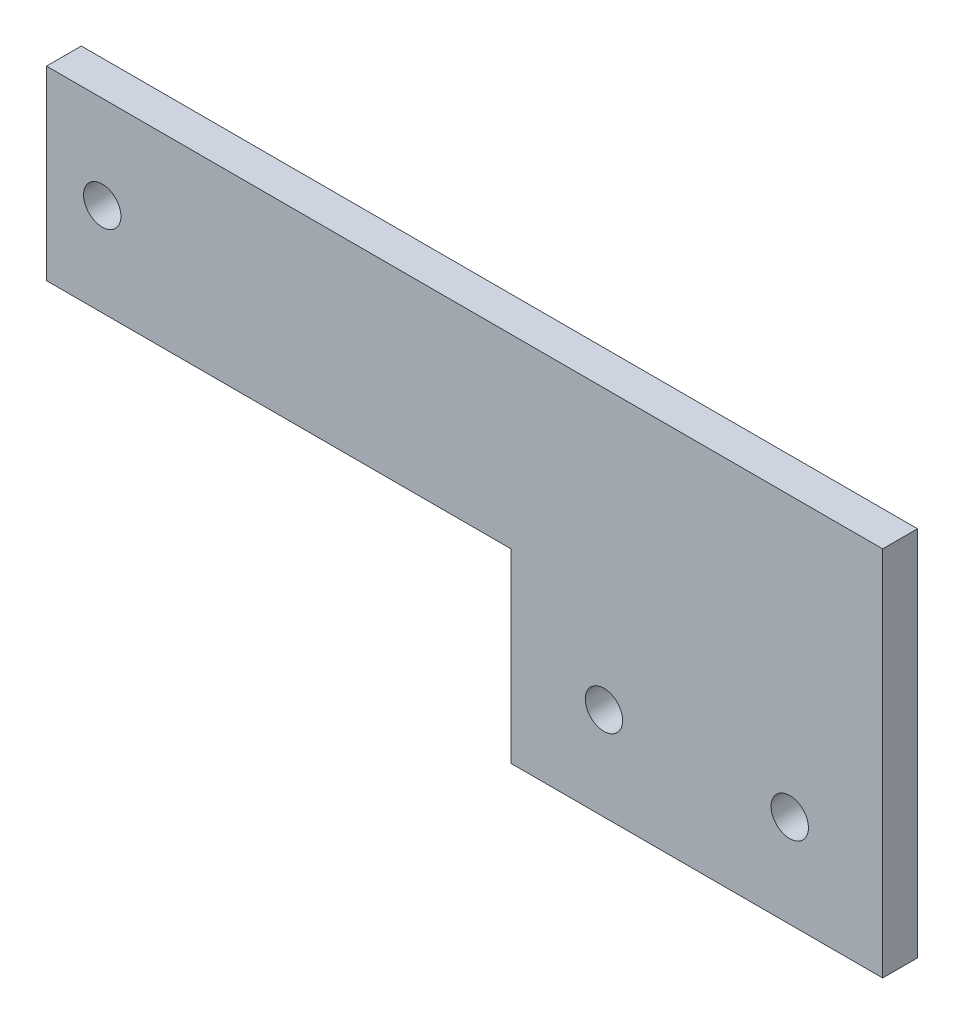
ISO-10303-21;
HEADER;
FILE_DESCRIPTION(('STEP AP214'),'2;1');
FILE_NAME('part.step','',(''),(''),'','','');
FILE_SCHEMA(('AUTOMOTIVE_DESIGN { 1 0 10303 214 1 1 1 1 }'));
ENDSEC;
DATA;
#1=APPLICATION_CONTEXT('core data for automotive mechanical design processes');
#2=APPLICATION_PROTOCOL_DEFINITION('international standard','automotive_design',2000,#1);
#3=PRODUCT_CONTEXT('',#1,'mechanical');
#4=PRODUCT('Part','Part','',(#3));
#5=PRODUCT_RELATED_PRODUCT_CATEGORY('part','',(#4));
#6=PRODUCT_DEFINITION_FORMATION('','',#4);
#7=PRODUCT_DEFINITION_CONTEXT('part definition',#1,'design');
#8=PRODUCT_DEFINITION('design','',#6,#7);
#9=PRODUCT_DEFINITION_SHAPE('','',#8);
#10=(LENGTH_UNIT() NAMED_UNIT(*) SI_UNIT(.MILLI.,.METRE.));
#11=(NAMED_UNIT(*) PLANE_ANGLE_UNIT() SI_UNIT($,.RADIAN.));
#12=(NAMED_UNIT(*) SI_UNIT($,.STERADIAN.) SOLID_ANGLE_UNIT());
#13=UNCERTAINTY_MEASURE_WITH_UNIT(LENGTH_MEASURE(1.E-05),#10,'distance_accuracy_value','');
#14=(GEOMETRIC_REPRESENTATION_CONTEXT(3) GLOBAL_UNCERTAINTY_ASSIGNED_CONTEXT((#13)) GLOBAL_UNIT_ASSIGNED_CONTEXT((#10,
#11,#12)) REPRESENTATION_CONTEXT('',''));
#15=CARTESIAN_POINT('',(0.,0.,0.));
#16=DIRECTION('',(0.,0.,1.));
#17=DIRECTION('',(1.,0.,0.));
#18=AXIS2_PLACEMENT_3D('',#15,#16,#17);
#19=CARTESIAN_POINT('',(0.,0.,4.7625));
#20=DIRECTION('',(0.,1.,0.));
#21=DIRECTION('',(0.,0.,1.));
#22=AXIS2_PLACEMENT_3D('',#19,#20,#21);
#23=PLANE('',#22);
#24=DIRECTION('',(1.,0.,0.));
#25=VECTOR('',#24,1.);
#26=CARTESIAN_POINT('',(0.,0.,0.));
#27=LINE('',#26,#25);
#28=CARTESIAN_POINT('',(0.,0.,0.));
#29=VERTEX_POINT('',#28);
#30=CARTESIAN_POINT('',(50.8,0.,0.));
#31=VERTEX_POINT('',#30);
#32=EDGE_CURVE('E130',#29,#31,#27,.T.);
#33=ORIENTED_EDGE('',*,*,#32,.T.);
#34=DIRECTION('',(0.,0.,-1.));
#35=VECTOR('',#34,1.);
#36=CARTESIAN_POINT('',(50.8,0.,4.7625));
#37=LINE('',#36,#35);
#38=CARTESIAN_POINT('',(50.8,0.,4.7625));
#39=VERTEX_POINT('',#38);
#40=EDGE_CURVE('E11',#39,#31,#37,.T.);
#41=ORIENTED_EDGE('',*,*,#40,.F.);
#42=DIRECTION('',(1.,0.,0.));
#43=VECTOR('',#42,1.);
#44=CARTESIAN_POINT('',(0.,0.,4.7625));
#45=LINE('',#44,#43);
#46=CARTESIAN_POINT('',(0.,0.,4.7625));
#47=VERTEX_POINT('',#46);
#48=EDGE_CURVE('E253',#47,#39,#45,.T.);
#49=ORIENTED_EDGE('',*,*,#48,.F.);
#50=DIRECTION('',(0.,0.,-1.));
#51=VECTOR('',#50,1.);
#52=CARTESIAN_POINT('',(0.,0.,4.7625));
#53=LINE('',#52,#51);
#54=EDGE_CURVE('E52',#47,#29,#53,.T.);
#55=ORIENTED_EDGE('',*,*,#54,.T.);
#56=EDGE_LOOP('',(#33,#41,#49,#55));
#57=FACE_BOUND('',#56,.T.);
#58=ADVANCED_FACE('F35',(#57),#23,.F.);
#59=CARTESIAN_POINT('',(50.8,0.,4.7625));
#60=DIRECTION('',(-1.,0.,0.));
#61=DIRECTION('',(0.,0.,1.));
#62=AXIS2_PLACEMENT_3D('',#59,#60,#61);
#63=PLANE('',#62);
#64=DIRECTION('',(0.,1.,0.));
#65=VECTOR('',#64,1.);
#66=CARTESIAN_POINT('',(50.8,0.,0.));
#67=LINE('',#66,#65);
#68=CARTESIAN_POINT('',(50.8,50.8,0.));
#69=VERTEX_POINT('',#68);
#70=EDGE_CURVE('E132',#31,#69,#67,.T.);
#71=ORIENTED_EDGE('',*,*,#70,.T.);
#72=DIRECTION('',(0.,0.,-1.));
#73=VECTOR('',#72,1.);
#74=CARTESIAN_POINT('',(50.8,50.8,4.7625));
#75=LINE('',#74,#73);
#76=CARTESIAN_POINT('',(50.8,50.8,4.7625));
#77=VERTEX_POINT('',#76);
#78=EDGE_CURVE('E44',#77,#69,#75,.T.);
#79=ORIENTED_EDGE('',*,*,#78,.F.);
#80=DIRECTION('',(0.,1.,0.));
#81=VECTOR('',#80,1.);
#82=CARTESIAN_POINT('',(50.8,0.,4.7625));
#83=LINE('',#82,#81);
#84=EDGE_CURVE('E85',#39,#77,#83,.T.);
#85=ORIENTED_EDGE('',*,*,#84,.F.);
#86=ORIENTED_EDGE('',*,*,#40,.T.);
#87=EDGE_LOOP('',(#71,#79,#85,#86));
#88=FACE_BOUND('',#87,.T.);
#89=ADVANCED_FACE('F153',(#88),#63,.F.);
#90=CARTESIAN_POINT('',(0.,50.8,4.7625));
#91=DIRECTION('',(0.,1.,0.));
#92=DIRECTION('',(0.,0.,1.));
#93=AXIS2_PLACEMENT_3D('',#90,#91,#92);
#94=PLANE('',#93);
#95=DIRECTION('',(1.,0.,0.));
#96=VECTOR('',#95,1.);
#97=CARTESIAN_POINT('',(0.,50.8,0.));
#98=LINE('',#97,#96);
#99=CARTESIAN_POINT('',(-63.5,50.8,0.));
#100=VERTEX_POINT('',#99);
#101=EDGE_CURVE('E135',#100,#69,#98,.T.);
#102=ORIENTED_EDGE('',*,*,#101,.F.);
#103=DIRECTION('',(0.,0.,-1.));
#104=VECTOR('',#103,1.);
#105=CARTESIAN_POINT('',(-63.5,50.8,4.7625));
#106=LINE('',#105,#104);
#107=CARTESIAN_POINT('',(-63.5,50.8,4.7625));
#108=VERTEX_POINT('',#107);
#109=EDGE_CURVE('E113',#108,#100,#106,.T.);
#110=ORIENTED_EDGE('',*,*,#109,.F.);
#111=DIRECTION('',(1.,0.,0.));
#112=VECTOR('',#111,1.);
#113=CARTESIAN_POINT('',(0.,50.8,4.7625));
#114=LINE('',#113,#112);
#115=EDGE_CURVE('E103',#108,#77,#114,.T.);
#116=ORIENTED_EDGE('',*,*,#115,.T.);
#117=ORIENTED_EDGE('',*,*,#78,.T.);
#118=EDGE_LOOP('',(#102,#110,#116,#117));
#119=FACE_BOUND('',#118,.T.);
#120=ADVANCED_FACE('F152',(#119),#94,.T.);
#121=CARTESIAN_POINT('',(-63.5,0.,4.7625));
#122=DIRECTION('',(1.,0.,0.));
#123=DIRECTION('',(0.,1.,0.));
#124=AXIS2_PLACEMENT_3D('',#121,#122,#123);
#125=PLANE('',#124);
#126=DIRECTION('',(0.,-1.,0.));
#127=VECTOR('',#126,1.);
#128=CARTESIAN_POINT('',(-63.5,0.,0.));
#129=LINE('',#128,#127);
#130=CARTESIAN_POINT('',(-63.5,25.4,0.));
#131=VERTEX_POINT('',#130);
#132=EDGE_CURVE('E110',#100,#131,#129,.T.);
#133=ORIENTED_EDGE('',*,*,#132,.T.);
#134=DIRECTION('',(0.,0.,-1.));
#135=VECTOR('',#134,1.);
#136=CARTESIAN_POINT('',(-63.5,25.4,4.7625));
#137=LINE('',#136,#135);
#138=CARTESIAN_POINT('',(-63.5,25.4,4.7625));
#139=VERTEX_POINT('',#138);
#140=EDGE_CURVE('E107',#139,#131,#137,.T.);
#141=ORIENTED_EDGE('',*,*,#140,.F.);
#142=DIRECTION('',(0.,-1.,0.));
#143=VECTOR('',#142,1.);
#144=CARTESIAN_POINT('',(-63.5,0.,4.7625));
#145=LINE('',#144,#143);
#146=EDGE_CURVE('E95',#108,#139,#145,.T.);
#147=ORIENTED_EDGE('',*,*,#146,.F.);
#148=ORIENTED_EDGE('',*,*,#109,.T.);
#149=EDGE_LOOP('',(#133,#141,#147,#148));
#150=FACE_BOUND('',#149,.T.);
#151=ADVANCED_FACE('F108',(#150),#125,.F.);
#152=CARTESIAN_POINT('',(0.,25.4,4.7625));
#153=DIRECTION('',(0.,1.,0.));
#154=DIRECTION('',(-1.,0.,0.));
#155=AXIS2_PLACEMENT_3D('',#152,#153,#154);
#156=PLANE('',#155);
#157=DIRECTION('',(1.,0.,0.));
#158=VECTOR('',#157,1.);
#159=CARTESIAN_POINT('',(0.,25.4,0.));
#160=LINE('',#159,#158);
#161=CARTESIAN_POINT('',(0.,25.4,0.));
#162=VERTEX_POINT('',#161);
#163=EDGE_CURVE('E139',#131,#162,#160,.T.);
#164=ORIENTED_EDGE('',*,*,#163,.T.);
#165=DIRECTION('',(0.,0.,-1.));
#166=VECTOR('',#165,1.);
#167=CARTESIAN_POINT('',(0.,25.4,4.7625));
#168=LINE('',#167,#166);
#169=CARTESIAN_POINT('',(0.,25.4,4.7625));
#170=VERTEX_POINT('',#169);
#171=EDGE_CURVE('E73',#170,#162,#168,.T.);
#172=ORIENTED_EDGE('',*,*,#171,.F.);
#173=DIRECTION('',(1.,0.,0.));
#174=VECTOR('',#173,1.);
#175=CARTESIAN_POINT('',(0.,25.4,4.7625));
#176=LINE('',#175,#174);
#177=EDGE_CURVE('E101',#139,#170,#176,.T.);
#178=ORIENTED_EDGE('',*,*,#177,.F.);
#179=ORIENTED_EDGE('',*,*,#140,.T.);
#180=EDGE_LOOP('',(#164,#172,#178,#179));
#181=FACE_BOUND('',#180,.T.);
#182=ADVANCED_FACE('F115',(#181),#156,.F.);
#183=CARTESIAN_POINT('',(0.,0.,4.7625));
#184=DIRECTION('',(-1.,0.,0.));
#185=DIRECTION('',(0.,0.,1.));
#186=AXIS2_PLACEMENT_3D('',#183,#184,#185);
#187=PLANE('',#186);
#188=DIRECTION('',(0.,1.,0.));
#189=VECTOR('',#188,1.);
#190=CARTESIAN_POINT('',(0.,0.,0.));
#191=LINE('',#190,#189);
#192=EDGE_CURVE('E141',#29,#162,#191,.T.);
#193=ORIENTED_EDGE('',*,*,#192,.F.);
#194=ORIENTED_EDGE('',*,*,#54,.F.);
#195=DIRECTION('',(0.,1.,0.));
#196=VECTOR('',#195,1.);
#197=CARTESIAN_POINT('',(0.,0.,4.7625));
#198=LINE('',#197,#196);
#199=EDGE_CURVE('E116',#47,#170,#198,.T.);
#200=ORIENTED_EDGE('',*,*,#199,.T.);
#201=ORIENTED_EDGE('',*,*,#171,.T.);
#202=EDGE_LOOP('',(#193,#194,#200,#201));
#203=FACE_BOUND('',#202,.T.);
#204=ADVANCED_FACE('F158',(#203),#187,.T.);
#205=CARTESIAN_POINT('',(12.7,12.7,4.7625));
#206=DIRECTION('',(0.,0.,-1.));
#207=DIRECTION('',(-1.,0.,0.));
#208=AXIS2_PLACEMENT_3D('',#205,#206,#207);
#209=CYLINDRICAL_SURFACE('',#208,2.5527);
#210=CARTESIAN_POINT('',(12.7,12.7,4.7625));
#211=DIRECTION('',(0.,0.,1.));
#212=DIRECTION('',(1.,0.,0.));
#213=AXIS2_PLACEMENT_3D('',#210,#211,#212);
#214=CIRCLE('',#213,2.5527);
#215=CARTESIAN_POINT('',(10.1473,12.7,4.7625));
#216=VERTEX_POINT('',#215);
#217=EDGE_CURVE('E252',#216,#216,#214,.T.);
#218=CARTESIAN_POINT('',(12.7,12.7,0.));
#219=DIRECTION('',(0.,0.,1.));
#220=DIRECTION('',(1.,0.,0.));
#221=AXIS2_PLACEMENT_3D('',#218,#219,#220);
#222=CIRCLE('',#221,2.5527);
#223=CARTESIAN_POINT('',(10.1473,12.7,0.));
#224=VERTEX_POINT('',#223);
#225=EDGE_CURVE('E127',#224,#224,#222,.T.);
#226=CARTESIAN_POINT('',(10.1473,12.7,4.7625));
#227=CARTESIAN_POINT('',(10.1473,12.7,4.712890625));
#228=CARTESIAN_POINT('',(10.1473,12.7,4.66328125));
#229=CARTESIAN_POINT('',(10.1473,12.7,4.5640625));
#230=CARTESIAN_POINT('',(10.1473,12.7,4.514453125));
#231=CARTESIAN_POINT('',(10.1473,12.7,4.415234375));
#232=CARTESIAN_POINT('',(10.1473,12.7,4.365625));
#233=CARTESIAN_POINT('',(10.1473,12.7,4.26640625));
#234=CARTESIAN_POINT('',(10.1473,12.7,4.216796875));
#235=CARTESIAN_POINT('',(10.1473,12.7,4.117578125));
#236=CARTESIAN_POINT('',(10.1473,12.7,4.06796875));
#237=CARTESIAN_POINT('',(10.1473,12.7,3.96875));
#238=CARTESIAN_POINT('',(10.1473,12.7,3.919140625));
#239=CARTESIAN_POINT('',(10.1473,12.7,3.819921875));
#240=CARTESIAN_POINT('',(10.1473,12.7,3.7703125));
#241=CARTESIAN_POINT('',(10.1473,12.7,3.67109375));
#242=CARTESIAN_POINT('',(10.1473,12.7,3.621484375));
#243=CARTESIAN_POINT('',(10.1473,12.7,3.522265625));
#244=CARTESIAN_POINT('',(10.1473,12.7,3.47265625));
#245=CARTESIAN_POINT('',(10.1473,12.7,3.3734375));
#246=CARTESIAN_POINT('',(10.1473,12.7,3.323828125));
#247=CARTESIAN_POINT('',(10.1473,12.7,3.224609375));
#248=CARTESIAN_POINT('',(10.1473,12.7,3.175));
#249=CARTESIAN_POINT('',(10.1473,12.7,3.07578125));
#250=CARTESIAN_POINT('',(10.1473,12.7,3.026171875));
#251=CARTESIAN_POINT('',(10.1473,12.7,2.926953125));
#252=CARTESIAN_POINT('',(10.1473,12.7,2.87734375));
#253=CARTESIAN_POINT('',(10.1473,12.7,2.778125));
#254=CARTESIAN_POINT('',(10.1473,12.7,2.728515625));
#255=CARTESIAN_POINT('',(10.1473,12.7,2.629296875));
#256=CARTESIAN_POINT('',(10.1473,12.7,2.5796875));
#257=CARTESIAN_POINT('',(10.1473,12.7,2.48046875));
#258=CARTESIAN_POINT('',(10.1473,12.7,2.430859375));
#259=CARTESIAN_POINT('',(10.1473,12.7,2.331640625));
#260=CARTESIAN_POINT('',(10.1473,12.7,2.28203125));
#261=CARTESIAN_POINT('',(10.1473,12.7,2.1828125));
#262=CARTESIAN_POINT('',(10.1473,12.7,2.133203125));
#263=CARTESIAN_POINT('',(10.1473,12.7,2.033984375));
#264=CARTESIAN_POINT('',(10.1473,12.7,1.984375));
#265=CARTESIAN_POINT('',(10.1473,12.7,1.88515625));
#266=CARTESIAN_POINT('',(10.1473,12.7,1.835546875));
#267=CARTESIAN_POINT('',(10.1473,12.7,1.736328125));
#268=CARTESIAN_POINT('',(10.1473,12.7,1.68671875));
#269=CARTESIAN_POINT('',(10.1473,12.7,1.5875));
#270=CARTESIAN_POINT('',(10.1473,12.7,1.537890625));
#271=CARTESIAN_POINT('',(10.1473,12.7,1.438671875));
#272=CARTESIAN_POINT('',(10.1473,12.7,1.3890625));
#273=CARTESIAN_POINT('',(10.1473,12.7,1.28984375));
#274=CARTESIAN_POINT('',(10.1473,12.7,1.240234375));
#275=CARTESIAN_POINT('',(10.1473,12.7,1.141015625));
#276=CARTESIAN_POINT('',(10.1473,12.7,1.09140625));
#277=CARTESIAN_POINT('',(10.1473,12.7,0.992187499999999));
#278=CARTESIAN_POINT('',(10.1473,12.7,0.942578124999999));
#279=CARTESIAN_POINT('',(10.1473,12.7,0.843359375));
#280=CARTESIAN_POINT('',(10.1473,12.7,0.79375));
#281=CARTESIAN_POINT('',(10.1473,12.7,0.69453125));
#282=CARTESIAN_POINT('',(10.1473,12.7,0.644921875));
#283=CARTESIAN_POINT('',(10.1473,12.7,0.545703125));
#284=CARTESIAN_POINT('',(10.1473,12.7,0.49609375));
#285=CARTESIAN_POINT('',(10.1473,12.7,0.396875));
#286=CARTESIAN_POINT('',(10.1473,12.7,0.347265625));
#287=CARTESIAN_POINT('',(10.1473,12.7,0.248046875));
#288=CARTESIAN_POINT('',(10.1473,12.7,0.1984375));
#289=CARTESIAN_POINT('',(10.1473,12.7,0.09921875));
#290=CARTESIAN_POINT('',(10.1473,12.7,0.049609375));
#291=CARTESIAN_POINT('',(10.1473,12.7,0.));
#292=B_SPLINE_CURVE_WITH_KNOTS('',3,(#226,#227,#228,#229,#230,#231,#232,#233,#234,#235,#236,
#237,#238,#239,#240,#241,#242,#243,#244,#245,#246,#247,#248,#249,#250,#251,#252,#253,#254,#255,
#256,#257,#258,#259,#260,#261,#262,#263,#264,#265,#266,#267,#268,#269,#270,#271,#272,#273,#274,
#275,#276,#277,#278,#279,#280,#281,#282,#283,#284,#285,#286,#287,#288,#289,#290,#291),
.UNSPECIFIED.,.F.,.F.,(4,2,2,2,2,2,2,2,2,2,2,2,2,2,2,2,2,2,2,2,2,2,2,2,2,2,2,2,2,2,2,2,4),(0.,
0.148828125,0.29765625,0.446484375,0.5953125,0.744140625,0.892968750000001,1.041796875,1.190625,
1.339453125,1.48828125,1.637109375,1.7859375,1.934765625,2.08359375,2.232421875,2.38125,
2.530078125,2.67890625,2.827734375,2.9765625,3.125390625,3.27421875,3.423046875,3.571875,
3.720703125,3.86953125,4.018359375,4.1671875,4.316015625,4.46484375,4.613671875,4.7625),.UNSPECIFIED.);
#293=EDGE_CURVE('BSEAM160',#216,#224,#292,.T.);
#294=ORIENTED_EDGE('',*,*,#217,.T.);
#295=ORIENTED_EDGE('',*,*,#225,.F.);
#296=ORIENTED_EDGE('',*,*,#293,.T.);
#297=ORIENTED_EDGE('',*,*,#293,.F.);
#298=EDGE_LOOP('',(#294,#296,#295,#297));
#299=FACE_BOUND('',#298,.T.);
#300=ADVANCED_FACE('F160',(#299),#209,.F.);
#301=CARTESIAN_POINT('',(38.1,12.7,4.7625));
#302=DIRECTION('',(0.,0.,-1.));
#303=DIRECTION('',(-1.,0.,0.));
#304=AXIS2_PLACEMENT_3D('',#301,#302,#303);
#305=CYLINDRICAL_SURFACE('',#304,2.5527);
#306=CARTESIAN_POINT('',(38.1,12.7,4.7625));
#307=DIRECTION('',(0.,0.,1.));
#308=DIRECTION('',(1.,0.,0.));
#309=AXIS2_PLACEMENT_3D('',#306,#307,#308);
#310=CIRCLE('',#309,2.5527);
#311=CARTESIAN_POINT('',(35.5473,12.7,4.7625));
#312=VERTEX_POINT('',#311);
#313=EDGE_CURVE('E147',#312,#312,#310,.T.);
#314=CARTESIAN_POINT('',(38.1,12.7,0.));
#315=DIRECTION('',(0.,0.,1.));
#316=DIRECTION('',(1.,0.,0.));
#317=AXIS2_PLACEMENT_3D('',#314,#315,#316);
#318=CIRCLE('',#317,2.5527);
#319=CARTESIAN_POINT('',(35.5473,12.7,0.));
#320=VERTEX_POINT('',#319);
#321=EDGE_CURVE('E124',#320,#320,#318,.T.);
#322=CARTESIAN_POINT('',(35.5473,12.7,4.7625));
#323=CARTESIAN_POINT('',(35.5473,12.7,4.712890625));
#324=CARTESIAN_POINT('',(35.5473,12.7,4.66328125));
#325=CARTESIAN_POINT('',(35.5473,12.7,4.5640625));
#326=CARTESIAN_POINT('',(35.5473,12.7,4.514453125));
#327=CARTESIAN_POINT('',(35.5473,12.7,4.415234375));
#328=CARTESIAN_POINT('',(35.5473,12.7,4.365625));
#329=CARTESIAN_POINT('',(35.5473,12.7,4.26640625));
#330=CARTESIAN_POINT('',(35.5473,12.7,4.216796875));
#331=CARTESIAN_POINT('',(35.5473,12.7,4.117578125));
#332=CARTESIAN_POINT('',(35.5473,12.7,4.06796875));
#333=CARTESIAN_POINT('',(35.5473,12.7,3.96875));
#334=CARTESIAN_POINT('',(35.5473,12.7,3.919140625));
#335=CARTESIAN_POINT('',(35.5473,12.7,3.819921875));
#336=CARTESIAN_POINT('',(35.5473,12.7,3.7703125));
#337=CARTESIAN_POINT('',(35.5473,12.7,3.67109375));
#338=CARTESIAN_POINT('',(35.5473,12.7,3.621484375));
#339=CARTESIAN_POINT('',(35.5473,12.7,3.522265625));
#340=CARTESIAN_POINT('',(35.5473,12.7,3.47265625));
#341=CARTESIAN_POINT('',(35.5473,12.7,3.3734375));
#342=CARTESIAN_POINT('',(35.5473,12.7,3.323828125));
#343=CARTESIAN_POINT('',(35.5473,12.7,3.224609375));
#344=CARTESIAN_POINT('',(35.5473,12.7,3.175));
#345=CARTESIAN_POINT('',(35.5473,12.7,3.07578125));
#346=CARTESIAN_POINT('',(35.5473,12.7,3.026171875));
#347=CARTESIAN_POINT('',(35.5473,12.7,2.926953125));
#348=CARTESIAN_POINT('',(35.5473,12.7,2.87734375));
#349=CARTESIAN_POINT('',(35.5473,12.7,2.778125));
#350=CARTESIAN_POINT('',(35.5473,12.7,2.728515625));
#351=CARTESIAN_POINT('',(35.5473,12.7,2.629296875));
#352=CARTESIAN_POINT('',(35.5473,12.7,2.5796875));
#353=CARTESIAN_POINT('',(35.5473,12.7,2.48046875));
#354=CARTESIAN_POINT('',(35.5473,12.7,2.430859375));
#355=CARTESIAN_POINT('',(35.5473,12.7,2.331640625));
#356=CARTESIAN_POINT('',(35.5473,12.7,2.28203125));
#357=CARTESIAN_POINT('',(35.5473,12.7,2.1828125));
#358=CARTESIAN_POINT('',(35.5473,12.7,2.133203125));
#359=CARTESIAN_POINT('',(35.5473,12.7,2.033984375));
#360=CARTESIAN_POINT('',(35.5473,12.7,1.984375));
#361=CARTESIAN_POINT('',(35.5473,12.7,1.88515625));
#362=CARTESIAN_POINT('',(35.5473,12.7,1.835546875));
#363=CARTESIAN_POINT('',(35.5473,12.7,1.736328125));
#364=CARTESIAN_POINT('',(35.5473,12.7,1.68671875));
#365=CARTESIAN_POINT('',(35.5473,12.7,1.5875));
#366=CARTESIAN_POINT('',(35.5473,12.7,1.537890625));
#367=CARTESIAN_POINT('',(35.5473,12.7,1.438671875));
#368=CARTESIAN_POINT('',(35.5473,12.7,1.3890625));
#369=CARTESIAN_POINT('',(35.5473,12.7,1.28984375));
#370=CARTESIAN_POINT('',(35.5473,12.7,1.240234375));
#371=CARTESIAN_POINT('',(35.5473,12.7,1.141015625));
#372=CARTESIAN_POINT('',(35.5473,12.7,1.09140625));
#373=CARTESIAN_POINT('',(35.5473,12.7,0.992187499999999));
#374=CARTESIAN_POINT('',(35.5473,12.7,0.942578124999999));
#375=CARTESIAN_POINT('',(35.5473,12.7,0.843359375));
#376=CARTESIAN_POINT('',(35.5473,12.7,0.79375));
#377=CARTESIAN_POINT('',(35.5473,12.7,0.69453125));
#378=CARTESIAN_POINT('',(35.5473,12.7,0.644921875));
#379=CARTESIAN_POINT('',(35.5473,12.7,0.545703125));
#380=CARTESIAN_POINT('',(35.5473,12.7,0.49609375));
#381=CARTESIAN_POINT('',(35.5473,12.7,0.396875));
#382=CARTESIAN_POINT('',(35.5473,12.7,0.347265625));
#383=CARTESIAN_POINT('',(35.5473,12.7,0.248046875));
#384=CARTESIAN_POINT('',(35.5473,12.7,0.1984375));
#385=CARTESIAN_POINT('',(35.5473,12.7,0.09921875));
#386=CARTESIAN_POINT('',(35.5473,12.7,0.049609375));
#387=CARTESIAN_POINT('',(35.5473,12.7,0.));
#388=B_SPLINE_CURVE_WITH_KNOTS('',3,(#322,#323,#324,#325,#326,#327,#328,#329,#330,#331,#332,
#333,#334,#335,#336,#337,#338,#339,#340,#341,#342,#343,#344,#345,#346,#347,#348,#349,#350,#351,
#352,#353,#354,#355,#356,#357,#358,#359,#360,#361,#362,#363,#364,#365,#366,#367,#368,#369,#370,
#371,#372,#373,#374,#375,#376,#377,#378,#379,#380,#381,#382,#383,#384,#385,#386,#387),
.UNSPECIFIED.,.F.,.F.,(4,2,2,2,2,2,2,2,2,2,2,2,2,2,2,2,2,2,2,2,2,2,2,2,2,2,2,2,2,2,2,2,4),(0.,
0.148828125,0.29765625,0.446484375,0.5953125,0.744140625,0.892968750000001,1.041796875,1.190625,
1.339453125,1.48828125,1.637109375,1.7859375,1.934765625,2.08359375,2.232421875,2.38125,
2.530078125,2.67890625,2.827734375,2.9765625,3.125390625,3.27421875,3.423046875,3.571875,
3.720703125,3.86953125,4.018359375,4.1671875,4.316015625,4.46484375,4.613671875,4.7625),.UNSPECIFIED.);
#389=EDGE_CURVE('BSEAM37',#312,#320,#388,.T.);
#390=ORIENTED_EDGE('',*,*,#313,.T.);
#391=ORIENTED_EDGE('',*,*,#321,.F.);
#392=ORIENTED_EDGE('',*,*,#389,.T.);
#393=ORIENTED_EDGE('',*,*,#389,.F.);
#394=EDGE_LOOP('',(#390,#392,#391,#393));
#395=FACE_BOUND('',#394,.T.);
#396=ADVANCED_FACE('F37',(#395),#305,.F.);
#397=CARTESIAN_POINT('',(-55.88,38.1,4.7625));
#398=DIRECTION('',(0.,0.,-1.));
#399=DIRECTION('',(-1.,0.,0.));
#400=AXIS2_PLACEMENT_3D('',#397,#398,#399);
#401=CYLINDRICAL_SURFACE('',#400,2.5527);
#402=CARTESIAN_POINT('',(-55.88,38.1,4.7625));
#403=DIRECTION('',(0.,0.,1.));
#404=DIRECTION('',(1.,0.,0.));
#405=AXIS2_PLACEMENT_3D('',#402,#403,#404);
#406=CIRCLE('',#405,2.5527);
#407=CARTESIAN_POINT('',(-58.4327,38.1,4.7625));
#408=VERTEX_POINT('',#407);
#409=EDGE_CURVE('E118',#408,#408,#406,.T.);
#410=CARTESIAN_POINT('',(-55.88,38.1,0.));
#411=DIRECTION('',(0.,0.,1.));
#412=DIRECTION('',(1.,0.,0.));
#413=AXIS2_PLACEMENT_3D('',#410,#411,#412);
#414=CIRCLE('',#413,2.5527);
#415=CARTESIAN_POINT('',(-58.4327,38.1,0.));
#416=VERTEX_POINT('',#415);
#417=EDGE_CURVE('E144',#416,#416,#414,.T.);
#418=CARTESIAN_POINT('',(-58.4327,38.1,4.7625));
#419=CARTESIAN_POINT('',(-58.4327,38.1,4.712890625));
#420=CARTESIAN_POINT('',(-58.4327,38.1,4.66328125));
#421=CARTESIAN_POINT('',(-58.4327,38.1,4.5640625));
#422=CARTESIAN_POINT('',(-58.4327,38.1,4.514453125));
#423=CARTESIAN_POINT('',(-58.4327,38.1,4.415234375));
#424=CARTESIAN_POINT('',(-58.4327,38.1,4.365625));
#425=CARTESIAN_POINT('',(-58.4327,38.1,4.26640625));
#426=CARTESIAN_POINT('',(-58.4327,38.1,4.216796875));
#427=CARTESIAN_POINT('',(-58.4327,38.1,4.117578125));
#428=CARTESIAN_POINT('',(-58.4327,38.1,4.06796875));
#429=CARTESIAN_POINT('',(-58.4327,38.1,3.96875));
#430=CARTESIAN_POINT('',(-58.4327,38.1,3.919140625));
#431=CARTESIAN_POINT('',(-58.4327,38.1,3.819921875));
#432=CARTESIAN_POINT('',(-58.4327,38.1,3.7703125));
#433=CARTESIAN_POINT('',(-58.4327,38.1,3.67109375));
#434=CARTESIAN_POINT('',(-58.4327,38.1,3.621484375));
#435=CARTESIAN_POINT('',(-58.4327,38.1,3.522265625));
#436=CARTESIAN_POINT('',(-58.4327,38.1,3.47265625));
#437=CARTESIAN_POINT('',(-58.4327,38.1,3.3734375));
#438=CARTESIAN_POINT('',(-58.4327,38.1,3.323828125));
#439=CARTESIAN_POINT('',(-58.4327,38.1,3.224609375));
#440=CARTESIAN_POINT('',(-58.4327,38.1,3.175));
#441=CARTESIAN_POINT('',(-58.4327,38.1,3.07578125));
#442=CARTESIAN_POINT('',(-58.4327,38.1,3.026171875));
#443=CARTESIAN_POINT('',(-58.4327,38.1,2.926953125));
#444=CARTESIAN_POINT('',(-58.4327,38.1,2.87734375));
#445=CARTESIAN_POINT('',(-58.4327,38.1,2.778125));
#446=CARTESIAN_POINT('',(-58.4327,38.1,2.728515625));
#447=CARTESIAN_POINT('',(-58.4327,38.1,2.629296875));
#448=CARTESIAN_POINT('',(-58.4327,38.1,2.5796875));
#449=CARTESIAN_POINT('',(-58.4327,38.1,2.48046875));
#450=CARTESIAN_POINT('',(-58.4327,38.1,2.430859375));
#451=CARTESIAN_POINT('',(-58.4327,38.1,2.331640625));
#452=CARTESIAN_POINT('',(-58.4327,38.1,2.28203125));
#453=CARTESIAN_POINT('',(-58.4327,38.1,2.1828125));
#454=CARTESIAN_POINT('',(-58.4327,38.1,2.133203125));
#455=CARTESIAN_POINT('',(-58.4327,38.1,2.033984375));
#456=CARTESIAN_POINT('',(-58.4327,38.1,1.984375));
#457=CARTESIAN_POINT('',(-58.4327,38.1,1.88515625));
#458=CARTESIAN_POINT('',(-58.4327,38.1,1.835546875));
#459=CARTESIAN_POINT('',(-58.4327,38.1,1.736328125));
#460=CARTESIAN_POINT('',(-58.4327,38.1,1.68671875));
#461=CARTESIAN_POINT('',(-58.4327,38.1,1.5875));
#462=CARTESIAN_POINT('',(-58.4327,38.1,1.537890625));
#463=CARTESIAN_POINT('',(-58.4327,38.1,1.438671875));
#464=CARTESIAN_POINT('',(-58.4327,38.1,1.3890625));
#465=CARTESIAN_POINT('',(-58.4327,38.1,1.28984375));
#466=CARTESIAN_POINT('',(-58.4327,38.1,1.240234375));
#467=CARTESIAN_POINT('',(-58.4327,38.1,1.141015625));
#468=CARTESIAN_POINT('',(-58.4327,38.1,1.09140625));
#469=CARTESIAN_POINT('',(-58.4327,38.1,0.992187499999999));
#470=CARTESIAN_POINT('',(-58.4327,38.1,0.942578124999999));
#471=CARTESIAN_POINT('',(-58.4327,38.1,0.843359375));
#472=CARTESIAN_POINT('',(-58.4327,38.1,0.79375));
#473=CARTESIAN_POINT('',(-58.4327,38.1,0.69453125));
#474=CARTESIAN_POINT('',(-58.4327,38.1,0.644921875));
#475=CARTESIAN_POINT('',(-58.4327,38.1,0.545703125));
#476=CARTESIAN_POINT('',(-58.4327,38.1,0.49609375));
#477=CARTESIAN_POINT('',(-58.4327,38.1,0.396875));
#478=CARTESIAN_POINT('',(-58.4327,38.1,0.347265625));
#479=CARTESIAN_POINT('',(-58.4327,38.1,0.248046875));
#480=CARTESIAN_POINT('',(-58.4327,38.1,0.1984375));
#481=CARTESIAN_POINT('',(-58.4327,38.1,0.09921875));
#482=CARTESIAN_POINT('',(-58.4327,38.1,0.049609375));
#483=CARTESIAN_POINT('',(-58.4327,38.1,0.));
#484=B_SPLINE_CURVE_WITH_KNOTS('',3,(#418,#419,#420,#421,#422,#423,#424,#425,#426,#427,#428,
#429,#430,#431,#432,#433,#434,#435,#436,#437,#438,#439,#440,#441,#442,#443,#444,#445,#446,#447,
#448,#449,#450,#451,#452,#453,#454,#455,#456,#457,#458,#459,#460,#461,#462,#463,#464,#465,#466,
#467,#468,#469,#470,#471,#472,#473,#474,#475,#476,#477,#478,#479,#480,#481,#482,#483),
.UNSPECIFIED.,.F.,.F.,(4,2,2,2,2,2,2,2,2,2,2,2,2,2,2,2,2,2,2,2,2,2,2,2,2,2,2,2,2,2,2,2,4),(0.,
0.148828125,0.29765625,0.446484375,0.5953125,0.744140625,0.892968750000001,1.041796875,1.190625,
1.339453125,1.48828125,1.637109375,1.7859375,1.934765625,2.08359375,2.232421875,2.38125,
2.530078125,2.67890625,2.827734375,2.9765625,3.125390625,3.27421875,3.423046875,3.571875,
3.720703125,3.86953125,4.018359375,4.1671875,4.316015625,4.46484375,4.613671875,4.7625),.UNSPECIFIED.);
#485=EDGE_CURVE('BSEAM206',#408,#416,#484,.T.);
#486=ORIENTED_EDGE('',*,*,#409,.T.);
#487=ORIENTED_EDGE('',*,*,#417,.F.);
#488=ORIENTED_EDGE('',*,*,#485,.T.);
#489=ORIENTED_EDGE('',*,*,#485,.F.);
#490=EDGE_LOOP('',(#486,#488,#487,#489));
#491=FACE_BOUND('',#490,.T.);
#492=ADVANCED_FACE('F206',(#491),#401,.F.);
#493=CARTESIAN_POINT('',(0.,0.,4.7625));
#494=DIRECTION('',(0.,0.,1.));
#495=DIRECTION('',(1.,0.,0.));
#496=AXIS2_PLACEMENT_3D('',#493,#494,#495);
#497=PLANE('',#496);
#498=ORIENTED_EDGE('',*,*,#313,.F.);
#499=EDGE_LOOP('',(#498));
#500=FACE_BOUND('',#499,.T.);
#501=ORIENTED_EDGE('',*,*,#217,.F.);
#502=EDGE_LOOP('',(#501));
#503=FACE_BOUND('',#502,.T.);
#504=ORIENTED_EDGE('',*,*,#48,.T.);
#505=ORIENTED_EDGE('',*,*,#84,.T.);
#506=ORIENTED_EDGE('',*,*,#115,.F.);
#507=ORIENTED_EDGE('',*,*,#146,.T.);
#508=ORIENTED_EDGE('',*,*,#177,.T.);
#509=ORIENTED_EDGE('',*,*,#199,.F.);
#510=EDGE_LOOP('',(#504,#505,#506,#507,#508,#509));
#511=FACE_BOUND('',#510,.T.);
#512=ORIENTED_EDGE('',*,*,#409,.F.);
#513=EDGE_LOOP('',(#512));
#514=FACE_BOUND('',#513,.T.);
#515=ADVANCED_FACE('F97',(#500,#503,#511,#514),#497,.T.);
#516=CARTESIAN_POINT('',(0.,0.,0.));
#517=DIRECTION('',(0.,0.,1.));
#518=DIRECTION('',(1.,0.,0.));
#519=AXIS2_PLACEMENT_3D('',#516,#517,#518);
#520=PLANE('',#519);
#521=ORIENTED_EDGE('',*,*,#321,.T.);
#522=EDGE_LOOP('',(#521));
#523=FACE_BOUND('',#522,.T.);
#524=ORIENTED_EDGE('',*,*,#225,.T.);
#525=EDGE_LOOP('',(#524));
#526=FACE_BOUND('',#525,.T.);
#527=ORIENTED_EDGE('',*,*,#32,.F.);
#528=ORIENTED_EDGE('',*,*,#192,.T.);
#529=ORIENTED_EDGE('',*,*,#163,.F.);
#530=ORIENTED_EDGE('',*,*,#132,.F.);
#531=ORIENTED_EDGE('',*,*,#101,.T.);
#532=ORIENTED_EDGE('',*,*,#70,.F.);
#533=EDGE_LOOP('',(#527,#528,#529,#530,#531,#532));
#534=FACE_BOUND('',#533,.T.);
#535=ORIENTED_EDGE('',*,*,#417,.T.);
#536=EDGE_LOOP('',(#535));
#537=FACE_BOUND('',#536,.T.);
#538=ADVANCED_FACE('F156',(#523,#526,#534,#537),#520,.F.);
#539=CLOSED_SHELL('',(#58,#89,#120,#151,#182,#204,#300,#396,#492,#515,#538));
#540=MANIFOLD_SOLID_BREP('B2',#539);
#541=ADVANCED_BREP_SHAPE_REPRESENTATION('',(#18,#540),#14);
#542=SHAPE_DEFINITION_REPRESENTATION(#9,#541);
ENDSEC;
END-ISO-10303-21;
